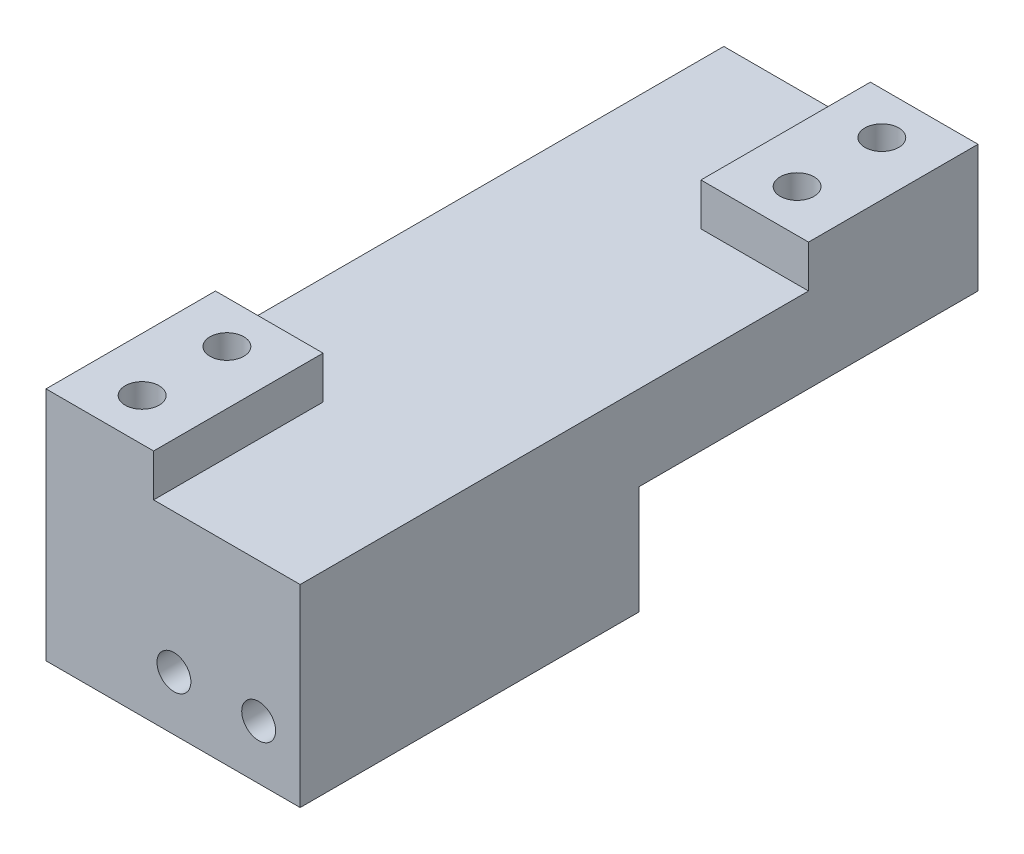
ISO-10303-21;
HEADER;
FILE_DESCRIPTION(('STEP AP214'),'2;1');
FILE_NAME('part.step','',(''),(''),'','','');
FILE_SCHEMA(('AUTOMOTIVE_DESIGN { 1 0 10303 214 1 1 1 1 }'));
ENDSEC;
DATA;
#1=APPLICATION_CONTEXT('core data for automotive mechanical design processes');
#2=APPLICATION_PROTOCOL_DEFINITION('international standard','automotive_design',2000,#1);
#3=PRODUCT_CONTEXT('',#1,'mechanical');
#4=PRODUCT('Part','Part','',(#3));
#5=PRODUCT_RELATED_PRODUCT_CATEGORY('part','',(#4));
#6=PRODUCT_DEFINITION_FORMATION('','',#4);
#7=PRODUCT_DEFINITION_CONTEXT('part definition',#1,'design');
#8=PRODUCT_DEFINITION('design','',#6,#7);
#9=PRODUCT_DEFINITION_SHAPE('','',#8);
#10=(LENGTH_UNIT() NAMED_UNIT(*) SI_UNIT(.MILLI.,.METRE.));
#11=(NAMED_UNIT(*) PLANE_ANGLE_UNIT() SI_UNIT($,.RADIAN.));
#12=(NAMED_UNIT(*) SI_UNIT($,.STERADIAN.) SOLID_ANGLE_UNIT());
#13=UNCERTAINTY_MEASURE_WITH_UNIT(LENGTH_MEASURE(1.E-05),#10,'distance_accuracy_value','');
#14=(GEOMETRIC_REPRESENTATION_CONTEXT(3) GLOBAL_UNCERTAINTY_ASSIGNED_CONTEXT((#13)) GLOBAL_UNIT_ASSIGNED_CONTEXT((#10,
#11,#12)) REPRESENTATION_CONTEXT('',''));
#15=CARTESIAN_POINT('',(0.,0.,0.));
#16=DIRECTION('',(0.,0.,1.));
#17=DIRECTION('',(1.,0.,0.));
#18=AXIS2_PLACEMENT_3D('',#15,#16,#17);
#19=CARTESIAN_POINT('',(0.,30.,0.));
#20=DIRECTION('',(-1.,0.,0.));
#21=DIRECTION('',(0.,0.,1.));
#22=AXIS2_PLACEMENT_3D('',#19,#20,#21);
#23=PLANE('',#22);
#24=DIRECTION('',(0.,-1.,0.));
#25=VECTOR('',#24,1.);
#26=CARTESIAN_POINT('',(0.,30.,0.));
#27=LINE('',#26,#25);
#28=CARTESIAN_POINT('',(0.,30.,0.));
#29=VERTEX_POINT('',#28);
#30=CARTESIAN_POINT('',(0.,7.2,0.));
#31=VERTEX_POINT('',#30);
#32=EDGE_CURVE('E162',#29,#31,#27,.T.);
#33=ORIENTED_EDGE('',*,*,#32,.T.);
#34=DIRECTION('',(0.,0.,-1.));
#35=VECTOR('',#34,1.);
#36=CARTESIAN_POINT('',(0.,7.2,0.));
#37=LINE('',#36,#35);
#38=CARTESIAN_POINT('',(0.,7.2,-40.));
#39=VERTEX_POINT('',#38);
#40=EDGE_CURVE('E138',#31,#39,#37,.T.);
#41=ORIENTED_EDGE('',*,*,#40,.T.);
#42=DIRECTION('',(0.,-1.,0.));
#43=VECTOR('',#42,1.);
#44=CARTESIAN_POINT('',(0.,20.,-40.));
#45=LINE('',#44,#43);
#46=CARTESIAN_POINT('',(0.,20.,-40.));
#47=VERTEX_POINT('',#46);
#48=EDGE_CURVE('E205',#47,#39,#45,.T.);
#49=ORIENTED_EDGE('',*,*,#48,.F.);
#50=DIRECTION('',(0.,0.,-1.));
#51=VECTOR('',#50,1.);
#52=CARTESIAN_POINT('',(0.,20.,-40.));
#53=LINE('',#52,#51);
#54=CARTESIAN_POINT('',(0.,20.,-80.));
#55=VERTEX_POINT('',#54);
#56=EDGE_CURVE('E179',#47,#55,#53,.T.);
#57=ORIENTED_EDGE('',*,*,#56,.T.);
#58=DIRECTION('',(0.,-1.,0.));
#59=VECTOR('',#58,1.);
#60=CARTESIAN_POINT('',(0.,30.,-80.));
#61=LINE('',#60,#59);
#62=CARTESIAN_POINT('',(0.,35.,-80.));
#63=VERTEX_POINT('',#62);
#64=EDGE_CURVE('E47',#63,#55,#61,.T.);
#65=ORIENTED_EDGE('',*,*,#64,.F.);
#66=DIRECTION('',(0.,0.,-1.));
#67=VECTOR('',#66,1.);
#68=CARTESIAN_POINT('',(0.,35.,-80.));
#69=LINE('',#68,#67);
#70=CARTESIAN_POINT('',(0.,35.,-60.));
#71=VERTEX_POINT('',#70);
#72=EDGE_CURVE('E240',#71,#63,#69,.T.);
#73=ORIENTED_EDGE('',*,*,#72,.F.);
#74=DIRECTION('',(0.,-1.,0.));
#75=VECTOR('',#74,1.);
#76=CARTESIAN_POINT('',(0.,35.,-60.));
#77=LINE('',#76,#75);
#78=CARTESIAN_POINT('',(0.,30.,-60.));
#79=VERTEX_POINT('',#78);
#80=EDGE_CURVE('E254',#71,#79,#77,.T.);
#81=ORIENTED_EDGE('',*,*,#80,.T.);
#82=DIRECTION('',(0.,0.,-1.));
#83=VECTOR('',#82,1.);
#84=CARTESIAN_POINT('',(0.,30.,0.));
#85=LINE('',#84,#83);
#86=EDGE_CURVE('E306',#29,#79,#85,.T.);
#87=ORIENTED_EDGE('',*,*,#86,.F.);
#88=EDGE_LOOP('',(#33,#41,#49,#57,#65,#73,#81,#87));
#89=FACE_BOUND('',#88,.T.);
#90=ADVANCED_FACE('F39',(#89),#23,.F.);
#91=CARTESIAN_POINT('',(0.,30.,-80.));
#92=DIRECTION('',(0.,0.,1.));
#93=DIRECTION('',(1.,0.,0.));
#94=AXIS2_PLACEMENT_3D('',#91,#92,#93);
#95=PLANE('',#94);
#96=DIRECTION('',(0.,1.,0.));
#97=VECTOR('',#96,1.);
#98=CARTESIAN_POINT('',(-20.,20.,-80.));
#99=LINE('',#98,#97);
#100=CARTESIAN_POINT('',(-20.,7.2,-80.));
#101=VERTEX_POINT('',#100);
#102=CARTESIAN_POINT('',(-20.,20.,-80.));
#103=VERTEX_POINT('',#102);
#104=EDGE_CURVE('E204',#101,#103,#99,.T.);
#105=ORIENTED_EDGE('',*,*,#104,.F.);
#106=DIRECTION('',(1.,0.,0.));
#107=VECTOR('',#106,1.);
#108=CARTESIAN_POINT('',(0.,7.2,-80.));
#109=LINE('',#108,#107);
#110=CARTESIAN_POINT('',(-30.,7.2,-80.));
#111=VERTEX_POINT('',#110);
#112=EDGE_CURVE('E144',#111,#101,#109,.T.);
#113=ORIENTED_EDGE('',*,*,#112,.F.);
#114=DIRECTION('',(0.,-1.,0.));
#115=VECTOR('',#114,1.);
#116=CARTESIAN_POINT('',(-30.,30.,-80.));
#117=LINE('',#116,#115);
#118=CARTESIAN_POINT('',(-30.,30.,-80.));
#119=VERTEX_POINT('',#118);
#120=EDGE_CURVE('E154',#119,#111,#117,.T.);
#121=ORIENTED_EDGE('',*,*,#120,.F.);
#122=DIRECTION('',(-1.,0.,0.));
#123=VECTOR('',#122,1.);
#124=CARTESIAN_POINT('',(0.,30.,-80.));
#125=LINE('',#124,#123);
#126=CARTESIAN_POINT('',(-12.7,30.,-80.));
#127=VERTEX_POINT('',#126);
#128=EDGE_CURVE('E310',#127,#119,#125,.T.);
#129=ORIENTED_EDGE('',*,*,#128,.F.);
#130=DIRECTION('',(0.,-1.,0.));
#131=VECTOR('',#130,1.);
#132=CARTESIAN_POINT('',(-12.7,35.,-80.));
#133=LINE('',#132,#131);
#134=CARTESIAN_POINT('',(-12.7,35.,-80.));
#135=VERTEX_POINT('',#134);
#136=EDGE_CURVE('E264',#135,#127,#133,.T.);
#137=ORIENTED_EDGE('',*,*,#136,.F.);
#138=DIRECTION('',(-1.,0.,0.));
#139=VECTOR('',#138,1.);
#140=CARTESIAN_POINT('',(0.,35.,-80.));
#141=LINE('',#140,#139);
#142=EDGE_CURVE('E244',#63,#135,#141,.T.);
#143=ORIENTED_EDGE('',*,*,#142,.F.);
#144=ORIENTED_EDGE('',*,*,#64,.T.);
#145=DIRECTION('',(1.,0.,0.));
#146=VECTOR('',#145,1.);
#147=CARTESIAN_POINT('',(0.,20.,-80.));
#148=LINE('',#147,#146);
#149=EDGE_CURVE('E210',#103,#55,#148,.T.);
#150=ORIENTED_EDGE('',*,*,#149,.F.);
#151=EDGE_LOOP('',(#105,#113,#121,#129,#137,#143,#144,#150));
#152=FACE_BOUND('',#151,.T.);
#153=ADVANCED_FACE('F330',(#152),#95,.F.);
#154=CARTESIAN_POINT('',(-30.,30.,0.));
#155=DIRECTION('',(1.,0.,0.));
#156=DIRECTION('',(0.,0.,-1.));
#157=AXIS2_PLACEMENT_3D('',#154,#155,#156);
#158=PLANE('',#157);
#159=ORIENTED_EDGE('',*,*,#120,.T.);
#160=DIRECTION('',(0.,0.,-1.));
#161=VECTOR('',#160,1.);
#162=CARTESIAN_POINT('',(-30.,7.2,0.));
#163=LINE('',#162,#161);
#164=CARTESIAN_POINT('',(-30.,7.2,0.));
#165=VERTEX_POINT('',#164);
#166=EDGE_CURVE('E135',#165,#111,#163,.T.);
#167=ORIENTED_EDGE('',*,*,#166,.F.);
#168=DIRECTION('',(0.,-1.,0.));
#169=VECTOR('',#168,1.);
#170=CARTESIAN_POINT('',(-30.,30.,0.));
#171=LINE('',#170,#169);
#172=CARTESIAN_POINT('',(-30.,35.,0.));
#173=VERTEX_POINT('',#172);
#174=EDGE_CURVE('E150',#173,#165,#171,.T.);
#175=ORIENTED_EDGE('',*,*,#174,.F.);
#176=DIRECTION('',(0.,0.,1.));
#177=VECTOR('',#176,1.);
#178=CARTESIAN_POINT('',(-30.,35.,0.));
#179=LINE('',#178,#177);
#180=CARTESIAN_POINT('',(-30.,35.,-20.));
#181=VERTEX_POINT('',#180);
#182=EDGE_CURVE('E276',#181,#173,#179,.T.);
#183=ORIENTED_EDGE('',*,*,#182,.F.);
#184=DIRECTION('',(0.,-1.,0.));
#185=VECTOR('',#184,1.);
#186=CARTESIAN_POINT('',(-30.,35.,-20.));
#187=LINE('',#186,#185);
#188=CARTESIAN_POINT('',(-30.,30.,-20.));
#189=VERTEX_POINT('',#188);
#190=EDGE_CURVE('E288',#181,#189,#187,.T.);
#191=ORIENTED_EDGE('',*,*,#190,.T.);
#192=DIRECTION('',(0.,0.,1.));
#193=VECTOR('',#192,1.);
#194=CARTESIAN_POINT('',(-30.,30.,0.));
#195=LINE('',#194,#193);
#196=EDGE_CURVE('E313',#119,#189,#195,.T.);
#197=ORIENTED_EDGE('',*,*,#196,.F.);
#198=EDGE_LOOP('',(#159,#167,#175,#183,#191,#197));
#199=FACE_BOUND('',#198,.T.);
#200=ADVANCED_FACE('F148',(#199),#158,.F.);
#201=CARTESIAN_POINT('',(0.,30.,0.));
#202=DIRECTION('',(0.,0.,-1.));
#203=DIRECTION('',(-1.,0.,0.));
#204=AXIS2_PLACEMENT_3D('',#201,#202,#203);
#205=PLANE('',#204);
#206=CARTESIAN_POINT('',(-14.9,13.6,0.));
#207=DIRECTION('',(0.,0.,-1.));
#208=DIRECTION('',(-1.,0.,0.));
#209=AXIS2_PLACEMENT_3D('',#206,#207,#208);
#210=CIRCLE('',#209,2.);
#211=CARTESIAN_POINT('',(-16.9,13.6,0.));
#212=VERTEX_POINT('',#211);
#213=EDGE_CURVE('E583',#212,#212,#210,.T.);
#214=ORIENTED_EDGE('',*,*,#213,.T.);
#215=EDGE_LOOP('',(#214));
#216=FACE_BOUND('',#215,.T.);
#217=CARTESIAN_POINT('',(-4.89999999999996,13.6,0.));
#218=DIRECTION('',(0.,0.,-1.));
#219=DIRECTION('',(-1.,0.,0.));
#220=AXIS2_PLACEMENT_3D('',#217,#218,#219);
#221=CIRCLE('',#220,2.);
#222=CARTESIAN_POINT('',(-6.89999999999996,13.6,0.));
#223=VERTEX_POINT('',#222);
#224=EDGE_CURVE('E184',#223,#223,#221,.T.);
#225=ORIENTED_EDGE('',*,*,#224,.T.);
#226=EDGE_LOOP('',(#225));
#227=FACE_BOUND('',#226,.T.);
#228=ORIENTED_EDGE('',*,*,#174,.T.);
#229=DIRECTION('',(1.,0.,0.));
#230=VECTOR('',#229,1.);
#231=CARTESIAN_POINT('',(0.,7.2,0.));
#232=LINE('',#231,#230);
#233=EDGE_CURVE('E132',#165,#31,#232,.T.);
#234=ORIENTED_EDGE('',*,*,#233,.T.);
#235=ORIENTED_EDGE('',*,*,#32,.F.);
#236=DIRECTION('',(1.,0.,0.));
#237=VECTOR('',#236,1.);
#238=CARTESIAN_POINT('',(0.,30.,0.));
#239=LINE('',#238,#237);
#240=CARTESIAN_POINT('',(-17.3,30.,0.));
#241=VERTEX_POINT('',#240);
#242=EDGE_CURVE('E167',#241,#29,#239,.T.);
#243=ORIENTED_EDGE('',*,*,#242,.F.);
#244=DIRECTION('',(0.,-1.,0.));
#245=VECTOR('',#244,1.);
#246=CARTESIAN_POINT('',(-17.3,35.,0.));
#247=LINE('',#246,#245);
#248=CARTESIAN_POINT('',(-17.3,35.,0.));
#249=VERTEX_POINT('',#248);
#250=EDGE_CURVE('E302',#249,#241,#247,.T.);
#251=ORIENTED_EDGE('',*,*,#250,.F.);
#252=DIRECTION('',(1.,0.,0.));
#253=VECTOR('',#252,1.);
#254=CARTESIAN_POINT('',(-30.,35.,0.));
#255=LINE('',#254,#253);
#256=EDGE_CURVE('E159',#173,#249,#255,.T.);
#257=ORIENTED_EDGE('',*,*,#256,.F.);
#258=EDGE_LOOP('',(#228,#234,#235,#243,#251,#257));
#259=FACE_BOUND('',#258,.T.);
#260=ADVANCED_FACE('F157',(#216,#227,#259),#205,.F.);
#261=CARTESIAN_POINT('',(0.,30.,0.));
#262=DIRECTION('',(0.,1.,0.));
#263=DIRECTION('',(0.,0.,1.));
#264=AXIS2_PLACEMENT_3D('',#261,#262,#263);
#265=PLANE('',#264);
#266=DIRECTION('',(1.,0.,0.));
#267=VECTOR('',#266,1.);
#268=CARTESIAN_POINT('',(0.,30.,-60.));
#269=LINE('',#268,#267);
#270=CARTESIAN_POINT('',(-12.7,30.,-60.));
#271=VERTEX_POINT('',#270);
#272=EDGE_CURVE('E245',#271,#79,#269,.T.);
#273=ORIENTED_EDGE('',*,*,#272,.F.);
#274=DIRECTION('',(0.,0.,1.));
#275=VECTOR('',#274,1.);
#276=CARTESIAN_POINT('',(-12.7,30.,-80.));
#277=LINE('',#276,#275);
#278=EDGE_CURVE('E239',#127,#271,#277,.T.);
#279=ORIENTED_EDGE('',*,*,#278,.F.);
#280=ORIENTED_EDGE('',*,*,#128,.T.);
#281=ORIENTED_EDGE('',*,*,#196,.T.);
#282=DIRECTION('',(-1.,0.,0.));
#283=VECTOR('',#282,1.);
#284=CARTESIAN_POINT('',(-30.,30.,-20.));
#285=LINE('',#284,#283);
#286=CARTESIAN_POINT('',(-17.3,30.,-20.));
#287=VERTEX_POINT('',#286);
#288=EDGE_CURVE('E279',#287,#189,#285,.T.);
#289=ORIENTED_EDGE('',*,*,#288,.F.);
#290=DIRECTION('',(0.,0.,-1.));
#291=VECTOR('',#290,1.);
#292=CARTESIAN_POINT('',(-17.3,30.,0.));
#293=LINE('',#292,#291);
#294=EDGE_CURVE('E275',#241,#287,#293,.T.);
#295=ORIENTED_EDGE('',*,*,#294,.F.);
#296=ORIENTED_EDGE('',*,*,#242,.T.);
#297=ORIENTED_EDGE('',*,*,#86,.T.);
#298=EDGE_LOOP('',(#273,#279,#280,#281,#289,#295,#296,#297));
#299=FACE_BOUND('',#298,.T.);
#300=ADVANCED_FACE('F319',(#299),#265,.T.);
#301=CARTESIAN_POINT('',(0.,35.,0.));
#302=DIRECTION('',(0.,-1.,0.));
#303=DIRECTION('',(0.,0.,-1.));
#304=AXIS2_PLACEMENT_3D('',#301,#302,#303);
#305=PLANE('',#304);
#306=ORIENTED_EDGE('',*,*,#182,.T.);
#307=ORIENTED_EDGE('',*,*,#256,.T.);
#308=DIRECTION('',(0.,0.,-1.));
#309=VECTOR('',#308,1.);
#310=CARTESIAN_POINT('',(-17.3,35.,0.));
#311=LINE('',#310,#309);
#312=CARTESIAN_POINT('',(-17.3,35.,-20.));
#313=VERTEX_POINT('',#312);
#314=EDGE_CURVE('E282',#249,#313,#311,.T.);
#315=ORIENTED_EDGE('',*,*,#314,.T.);
#316=DIRECTION('',(-1.,0.,0.));
#317=VECTOR('',#316,1.);
#318=CARTESIAN_POINT('',(-30.,35.,-20.));
#319=LINE('',#318,#317);
#320=EDGE_CURVE('E285',#313,#181,#319,.T.);
#321=ORIENTED_EDGE('',*,*,#320,.T.);
#322=EDGE_LOOP('',(#306,#307,#315,#321));
#323=FACE_BOUND('',#322,.T.);
#324=CARTESIAN_POINT('',(-23.65,35.,-5.));
#325=DIRECTION('',(0.,1.,0.));
#326=DIRECTION('',(0.,0.,1.));
#327=AXIS2_PLACEMENT_3D('',#324,#325,#326);
#328=CIRCLE('',#327,2.);
#329=CARTESIAN_POINT('',(-23.65,35.,-3.));
#330=VERTEX_POINT('',#329);
#331=EDGE_CURVE('E271',#330,#330,#328,.T.);
#332=ORIENTED_EDGE('',*,*,#331,.F.);
#333=EDGE_LOOP('',(#332));
#334=FACE_BOUND('',#333,.T.);
#335=CARTESIAN_POINT('',(-23.65,35.,-15.));
#336=DIRECTION('',(0.,1.,0.));
#337=DIRECTION('',(0.,0.,1.));
#338=AXIS2_PLACEMENT_3D('',#335,#336,#337);
#339=CIRCLE('',#338,2.);
#340=CARTESIAN_POINT('',(-23.65,35.,-13.));
#341=VERTEX_POINT('',#340);
#342=EDGE_CURVE('E267',#341,#341,#339,.T.);
#343=ORIENTED_EDGE('',*,*,#342,.F.);
#344=EDGE_LOOP('',(#343));
#345=FACE_BOUND('',#344,.T.);
#346=ADVANCED_FACE('F342',(#323,#334,#345),#305,.F.);
#347=CARTESIAN_POINT('',(-17.3,35.,0.));
#348=DIRECTION('',(-1.,0.,0.));
#349=DIRECTION('',(0.,0.,1.));
#350=AXIS2_PLACEMENT_3D('',#347,#348,#349);
#351=PLANE('',#350);
#352=ORIENTED_EDGE('',*,*,#294,.T.);
#353=DIRECTION('',(0.,-1.,0.));
#354=VECTOR('',#353,1.);
#355=CARTESIAN_POINT('',(-17.3,35.,-20.));
#356=LINE('',#355,#354);
#357=EDGE_CURVE('E298',#313,#287,#356,.T.);
#358=ORIENTED_EDGE('',*,*,#357,.F.);
#359=ORIENTED_EDGE('',*,*,#314,.F.);
#360=ORIENTED_EDGE('',*,*,#250,.T.);
#361=EDGE_LOOP('',(#352,#358,#359,#360));
#362=FACE_BOUND('',#361,.T.);
#363=ADVANCED_FACE('F340',(#362),#351,.F.);
#364=CARTESIAN_POINT('',(-30.,35.,-20.));
#365=DIRECTION('',(0.,0.,1.));
#366=DIRECTION('',(1.,0.,0.));
#367=AXIS2_PLACEMENT_3D('',#364,#365,#366);
#368=PLANE('',#367);
#369=ORIENTED_EDGE('',*,*,#288,.T.);
#370=ORIENTED_EDGE('',*,*,#190,.F.);
#371=ORIENTED_EDGE('',*,*,#320,.F.);
#372=ORIENTED_EDGE('',*,*,#357,.T.);
#373=EDGE_LOOP('',(#369,#370,#371,#372));
#374=FACE_BOUND('',#373,.T.);
#375=ADVANCED_FACE('F335',(#374),#368,.F.);
#376=CARTESIAN_POINT('',(-23.65,35.,-5.));
#377=DIRECTION('',(0.,-1.,0.));
#378=DIRECTION('',(0.,0.,-1.));
#379=AXIS2_PLACEMENT_3D('',#376,#377,#378);
#380=CYLINDRICAL_SURFACE('',#379,2.);
#381=CARTESIAN_POINT('',(-23.65,7.2,-5.));
#382=DIRECTION('',(0.,1.,0.));
#383=DIRECTION('',(-1.,0.,0.));
#384=AXIS2_PLACEMENT_3D('',#381,#382,#383);
#385=CIRCLE('',#384,2.);
#386=CARTESIAN_POINT('',(-25.65,7.2,-5.));
#387=VERTEX_POINT('',#386);
#388=EDGE_CURVE('E197',#387,#387,#385,.T.);
#389=ORIENTED_EDGE('',*,*,#388,.F.);
#390=EDGE_LOOP('',(#389));
#391=FACE_BOUND('',#390,.T.);
#392=ORIENTED_EDGE('',*,*,#331,.T.);
#393=EDGE_LOOP('',(#392));
#394=FACE_BOUND('',#393,.T.);
#395=ADVANCED_FACE('F353',(#391,#394),#380,.F.);
#396=CARTESIAN_POINT('',(-23.65,35.,-15.));
#397=DIRECTION('',(0.,-1.,0.));
#398=DIRECTION('',(0.,0.,-1.));
#399=AXIS2_PLACEMENT_3D('',#396,#397,#398);
#400=CYLINDRICAL_SURFACE('',#399,2.);
#401=CARTESIAN_POINT('',(-23.65,7.2,-15.));
#402=DIRECTION('',(0.,1.,0.));
#403=DIRECTION('',(-1.,0.,0.));
#404=AXIS2_PLACEMENT_3D('',#401,#402,#403);
#405=CIRCLE('',#404,2.);
#406=CARTESIAN_POINT('',(-25.65,7.2,-15.));
#407=VERTEX_POINT('',#406);
#408=EDGE_CURVE('E190',#407,#407,#405,.T.);
#409=ORIENTED_EDGE('',*,*,#408,.F.);
#410=EDGE_LOOP('',(#409));
#411=FACE_BOUND('',#410,.T.);
#412=ORIENTED_EDGE('',*,*,#342,.T.);
#413=EDGE_LOOP('',(#412));
#414=FACE_BOUND('',#413,.T.);
#415=ADVANCED_FACE('F350',(#411,#414),#400,.F.);
#416=CARTESIAN_POINT('',(0.,35.,0.));
#417=DIRECTION('',(0.,-1.,0.));
#418=DIRECTION('',(0.,0.,-1.));
#419=AXIS2_PLACEMENT_3D('',#416,#417,#418);
#420=PLANE('',#419);
#421=ORIENTED_EDGE('',*,*,#72,.T.);
#422=ORIENTED_EDGE('',*,*,#142,.T.);
#423=DIRECTION('',(0.,0.,1.));
#424=VECTOR('',#423,1.);
#425=CARTESIAN_POINT('',(-12.7,35.,-80.));
#426=LINE('',#425,#424);
#427=CARTESIAN_POINT('',(-12.7,35.,-60.));
#428=VERTEX_POINT('',#427);
#429=EDGE_CURVE('E248',#135,#428,#426,.T.);
#430=ORIENTED_EDGE('',*,*,#429,.T.);
#431=DIRECTION('',(1.,0.,0.));
#432=VECTOR('',#431,1.);
#433=CARTESIAN_POINT('',(0.,35.,-60.));
#434=LINE('',#433,#432);
#435=EDGE_CURVE('E251',#428,#71,#434,.T.);
#436=ORIENTED_EDGE('',*,*,#435,.T.);
#437=EDGE_LOOP('',(#421,#422,#430,#436));
#438=FACE_BOUND('',#437,.T.);
#439=CARTESIAN_POINT('',(-6.35,35.,-65.));
#440=DIRECTION('',(0.,1.,0.));
#441=DIRECTION('',(0.,0.,1.));
#442=AXIS2_PLACEMENT_3D('',#439,#440,#441);
#443=CIRCLE('',#442,2.);
#444=CARTESIAN_POINT('',(-6.35,35.,-63.));
#445=VERTEX_POINT('',#444);
#446=EDGE_CURVE('E235',#445,#445,#443,.T.);
#447=ORIENTED_EDGE('',*,*,#446,.F.);
#448=EDGE_LOOP('',(#447));
#449=FACE_BOUND('',#448,.T.);
#450=CARTESIAN_POINT('',(-6.35,35.,-75.));
#451=DIRECTION('',(0.,1.,0.));
#452=DIRECTION('',(0.,0.,1.));
#453=AXIS2_PLACEMENT_3D('',#450,#451,#452);
#454=CIRCLE('',#453,2.);
#455=CARTESIAN_POINT('',(-6.35,35.,-73.));
#456=VERTEX_POINT('',#455);
#457=EDGE_CURVE('E231',#456,#456,#454,.T.);
#458=ORIENTED_EDGE('',*,*,#457,.F.);
#459=EDGE_LOOP('',(#458));
#460=FACE_BOUND('',#459,.T.);
#461=ADVANCED_FACE('F352',(#438,#449,#460),#420,.F.);
#462=CARTESIAN_POINT('',(-12.7,35.,-80.));
#463=DIRECTION('',(1.,0.,0.));
#464=DIRECTION('',(0.,0.,-1.));
#465=AXIS2_PLACEMENT_3D('',#462,#463,#464);
#466=PLANE('',#465);
#467=ORIENTED_EDGE('',*,*,#278,.T.);
#468=DIRECTION('',(0.,-1.,0.));
#469=VECTOR('',#468,1.);
#470=CARTESIAN_POINT('',(-12.7,35.,-60.));
#471=LINE('',#470,#469);
#472=EDGE_CURVE('E61',#428,#271,#471,.T.);
#473=ORIENTED_EDGE('',*,*,#472,.F.);
#474=ORIENTED_EDGE('',*,*,#429,.F.);
#475=ORIENTED_EDGE('',*,*,#136,.T.);
#476=EDGE_LOOP('',(#467,#473,#474,#475));
#477=FACE_BOUND('',#476,.T.);
#478=ADVANCED_FACE('F360',(#477),#466,.F.);
#479=CARTESIAN_POINT('',(0.,35.,-60.));
#480=DIRECTION('',(0.,0.,-1.));
#481=DIRECTION('',(-1.,0.,0.));
#482=AXIS2_PLACEMENT_3D('',#479,#480,#481);
#483=PLANE('',#482);
#484=ORIENTED_EDGE('',*,*,#272,.T.);
#485=ORIENTED_EDGE('',*,*,#80,.F.);
#486=ORIENTED_EDGE('',*,*,#435,.F.);
#487=ORIENTED_EDGE('',*,*,#472,.T.);
#488=EDGE_LOOP('',(#484,#485,#486,#487));
#489=FACE_BOUND('',#488,.T.);
#490=ADVANCED_FACE('F324',(#489),#483,.F.);
#491=CARTESIAN_POINT('',(-6.35,35.,-65.));
#492=DIRECTION('',(0.,-1.,0.));
#493=DIRECTION('',(0.,0.,-1.));
#494=AXIS2_PLACEMENT_3D('',#491,#492,#493);
#495=CYLINDRICAL_SURFACE('',#494,2.);
#496=CARTESIAN_POINT('',(-6.35,20.,-65.));
#497=DIRECTION('',(0.,1.,0.));
#498=DIRECTION('',(0.,0.,1.));
#499=AXIS2_PLACEMENT_3D('',#496,#497,#498);
#500=CIRCLE('',#499,2.);
#501=CARTESIAN_POINT('',(-6.35,20.,-63.));
#502=VERTEX_POINT('',#501);
#503=EDGE_CURVE('E178',#502,#502,#500,.T.);
#504=ORIENTED_EDGE('',*,*,#503,.F.);
#505=EDGE_LOOP('',(#504));
#506=FACE_BOUND('',#505,.T.);
#507=ORIENTED_EDGE('',*,*,#446,.T.);
#508=EDGE_LOOP('',(#507));
#509=FACE_BOUND('',#508,.T.);
#510=ADVANCED_FACE('F466',(#506,#509),#495,.F.);
#511=CARTESIAN_POINT('',(-6.35,35.,-75.));
#512=DIRECTION('',(0.,-1.,0.));
#513=DIRECTION('',(0.,0.,-1.));
#514=AXIS2_PLACEMENT_3D('',#511,#512,#513);
#515=CYLINDRICAL_SURFACE('',#514,2.);
#516=CARTESIAN_POINT('',(-6.35,20.,-75.));
#517=DIRECTION('',(0.,1.,0.));
#518=DIRECTION('',(0.,0.,1.));
#519=AXIS2_PLACEMENT_3D('',#516,#517,#518);
#520=CIRCLE('',#519,2.);
#521=CARTESIAN_POINT('',(-6.35,20.,-73.));
#522=VERTEX_POINT('',#521);
#523=EDGE_CURVE('E174',#522,#522,#520,.T.);
#524=ORIENTED_EDGE('',*,*,#523,.F.);
#525=EDGE_LOOP('',(#524));
#526=FACE_BOUND('',#525,.T.);
#527=ORIENTED_EDGE('',*,*,#457,.T.);
#528=EDGE_LOOP('',(#527));
#529=FACE_BOUND('',#528,.T.);
#530=ADVANCED_FACE('F461',(#526,#529),#515,.F.);
#531=CARTESIAN_POINT('',(0.,20.,-40.));
#532=DIRECTION('',(0.,1.,0.));
#533=DIRECTION('',(0.,0.,1.));
#534=AXIS2_PLACEMENT_3D('',#531,#532,#533);
#535=PLANE('',#534);
#536=ORIENTED_EDGE('',*,*,#503,.T.);
#537=EDGE_LOOP('',(#536));
#538=FACE_BOUND('',#537,.T.);
#539=ORIENTED_EDGE('',*,*,#523,.T.);
#540=EDGE_LOOP('',(#539));
#541=FACE_BOUND('',#540,.T.);
#542=ORIENTED_EDGE('',*,*,#149,.T.);
#543=ORIENTED_EDGE('',*,*,#56,.F.);
#544=DIRECTION('',(1.,0.,0.));
#545=VECTOR('',#544,1.);
#546=CARTESIAN_POINT('',(0.,20.,-40.));
#547=LINE('',#546,#545);
#548=CARTESIAN_POINT('',(-20.,20.,-40.));
#549=VERTEX_POINT('',#548);
#550=EDGE_CURVE('E213',#549,#47,#547,.T.);
#551=ORIENTED_EDGE('',*,*,#550,.F.);
#552=DIRECTION('',(0.,0.,-1.));
#553=VECTOR('',#552,1.);
#554=CARTESIAN_POINT('',(-20.,20.,-40.));
#555=LINE('',#554,#553);
#556=EDGE_CURVE('E217',#549,#103,#555,.T.);
#557=ORIENTED_EDGE('',*,*,#556,.T.);
#558=EDGE_LOOP('',(#542,#543,#551,#557));
#559=FACE_BOUND('',#558,.T.);
#560=ADVANCED_FACE('F416',(#538,#541,#559),#535,.F.);
#561=CARTESIAN_POINT('',(-20.,20.,-40.));
#562=DIRECTION('',(-1.,0.,0.));
#563=DIRECTION('',(0.,0.,1.));
#564=AXIS2_PLACEMENT_3D('',#561,#562,#563);
#565=PLANE('',#564);
#566=DIRECTION('',(0.,1.,0.));
#567=VECTOR('',#566,1.);
#568=CARTESIAN_POINT('',(-20.,20.,-40.));
#569=LINE('',#568,#567);
#570=CARTESIAN_POINT('',(-20.,7.2,-40.));
#571=VERTEX_POINT('',#570);
#572=EDGE_CURVE('E209',#571,#549,#569,.T.);
#573=ORIENTED_EDGE('',*,*,#572,.F.);
#574=DIRECTION('',(0.,0.,-1.));
#575=VECTOR('',#574,1.);
#576=CARTESIAN_POINT('',(-20.,7.2,-40.));
#577=LINE('',#576,#575);
#578=EDGE_CURVE('E53',#571,#101,#577,.T.);
#579=ORIENTED_EDGE('',*,*,#578,.T.);
#580=ORIENTED_EDGE('',*,*,#104,.T.);
#581=ORIENTED_EDGE('',*,*,#556,.F.);
#582=EDGE_LOOP('',(#573,#579,#580,#581));
#583=FACE_BOUND('',#582,.T.);
#584=ADVANCED_FACE('F410',(#583),#565,.F.);
#585=CARTESIAN_POINT('',(0.,0.,-40.));
#586=DIRECTION('',(0.,0.,-1.));
#587=DIRECTION('',(-1.,0.,0.));
#588=AXIS2_PLACEMENT_3D('',#585,#586,#587);
#589=PLANE('',#588);
#590=DIRECTION('',(1.,0.,0.));
#591=VECTOR('',#590,1.);
#592=CARTESIAN_POINT('',(0.,7.2,-40.));
#593=LINE('',#592,#591);
#594=EDGE_CURVE('E11',#571,#39,#593,.T.);
#595=ORIENTED_EDGE('',*,*,#594,.F.);
#596=ORIENTED_EDGE('',*,*,#572,.T.);
#597=ORIENTED_EDGE('',*,*,#550,.T.);
#598=ORIENTED_EDGE('',*,*,#48,.T.);
#599=EDGE_LOOP('',(#595,#596,#597,#598));
#600=FACE_BOUND('',#599,.T.);
#601=CARTESIAN_POINT('',(-14.9,13.6,-40.));
#602=DIRECTION('',(0.,0.,-1.));
#603=DIRECTION('',(-1.,0.,0.));
#604=AXIS2_PLACEMENT_3D('',#601,#602,#603);
#605=CIRCLE('',#604,2.);
#606=CARTESIAN_POINT('',(-16.9,13.6,-40.));
#607=VERTEX_POINT('',#606);
#608=EDGE_CURVE('E183',#607,#607,#605,.T.);
#609=ORIENTED_EDGE('',*,*,#608,.F.);
#610=EDGE_LOOP('',(#609));
#611=FACE_BOUND('',#610,.T.);
#612=CARTESIAN_POINT('',(-4.89999999999998,13.6,-40.));
#613=DIRECTION('',(0.,0.,-1.));
#614=DIRECTION('',(-1.,0.,0.));
#615=AXIS2_PLACEMENT_3D('',#612,#613,#614);
#616=CIRCLE('',#615,2.);
#617=CARTESIAN_POINT('',(-6.89999999999998,13.6,-40.));
#618=VERTEX_POINT('',#617);
#619=EDGE_CURVE('E180',#618,#618,#616,.T.);
#620=ORIENTED_EDGE('',*,*,#619,.F.);
#621=EDGE_LOOP('',(#620));
#622=FACE_BOUND('',#621,.T.);
#623=ADVANCED_FACE('F415',(#600,#611,#622),#589,.T.);
#624=CARTESIAN_POINT('',(-4.89999999999996,13.6,0.));
#625=DIRECTION('',(0.,0.,-1.));
#626=DIRECTION('',(-1.,0.,0.));
#627=AXIS2_PLACEMENT_3D('',#624,#625,#626);
#628=CYLINDRICAL_SURFACE('',#627,2.);
#629=ORIENTED_EDGE('',*,*,#619,.T.);
#630=EDGE_LOOP('',(#629));
#631=FACE_BOUND('',#630,.T.);
#632=ORIENTED_EDGE('',*,*,#224,.F.);
#633=EDGE_LOOP('',(#632));
#634=FACE_BOUND('',#633,.T.);
#635=ADVANCED_FACE('F427',(#631,#634),#628,.F.);
#636=CARTESIAN_POINT('',(-14.9,13.6,0.));
#637=DIRECTION('',(0.,0.,-1.));
#638=DIRECTION('',(-1.,0.,0.));
#639=AXIS2_PLACEMENT_3D('',#636,#637,#638);
#640=CYLINDRICAL_SURFACE('',#639,2.);
#641=ORIENTED_EDGE('',*,*,#608,.T.);
#642=EDGE_LOOP('',(#641));
#643=FACE_BOUND('',#642,.T.);
#644=ORIENTED_EDGE('',*,*,#213,.F.);
#645=EDGE_LOOP('',(#644));
#646=FACE_BOUND('',#645,.T.);
#647=ADVANCED_FACE('F437',(#643,#646),#640,.F.);
#648=CARTESIAN_POINT('',(0.,7.2,0.));
#649=DIRECTION('',(0.,1.,0.));
#650=DIRECTION('',(-1.,0.,0.));
#651=AXIS2_PLACEMENT_3D('',#648,#649,#650);
#652=PLANE('',#651);
#653=ORIENTED_EDGE('',*,*,#388,.T.);
#654=EDGE_LOOP('',(#653));
#655=FACE_BOUND('',#654,.T.);
#656=ORIENTED_EDGE('',*,*,#408,.T.);
#657=EDGE_LOOP('',(#656));
#658=FACE_BOUND('',#657,.T.);
#659=ORIENTED_EDGE('',*,*,#594,.T.);
#660=ORIENTED_EDGE('',*,*,#40,.F.);
#661=ORIENTED_EDGE('',*,*,#233,.F.);
#662=ORIENTED_EDGE('',*,*,#166,.T.);
#663=ORIENTED_EDGE('',*,*,#112,.T.);
#664=ORIENTED_EDGE('',*,*,#578,.F.);
#665=EDGE_LOOP('',(#659,#660,#661,#662,#663,#664));
#666=FACE_BOUND('',#665,.T.);
#667=ADVANCED_FACE('F134',(#655,#658,#666),#652,.F.);
#668=CLOSED_SHELL('',(#90,#153,#200,#260,#300,#346,#363,#375,#395,#415,#461,#478,#490,#510,#530,
#560,#584,#623,#635,#647,#667));
#669=MANIFOLD_SOLID_BREP('B2',#668);
#670=ADVANCED_BREP_SHAPE_REPRESENTATION('',(#18,#669),#14);
#671=SHAPE_DEFINITION_REPRESENTATION(#9,#670);
ENDSEC;
END-ISO-10303-21;
